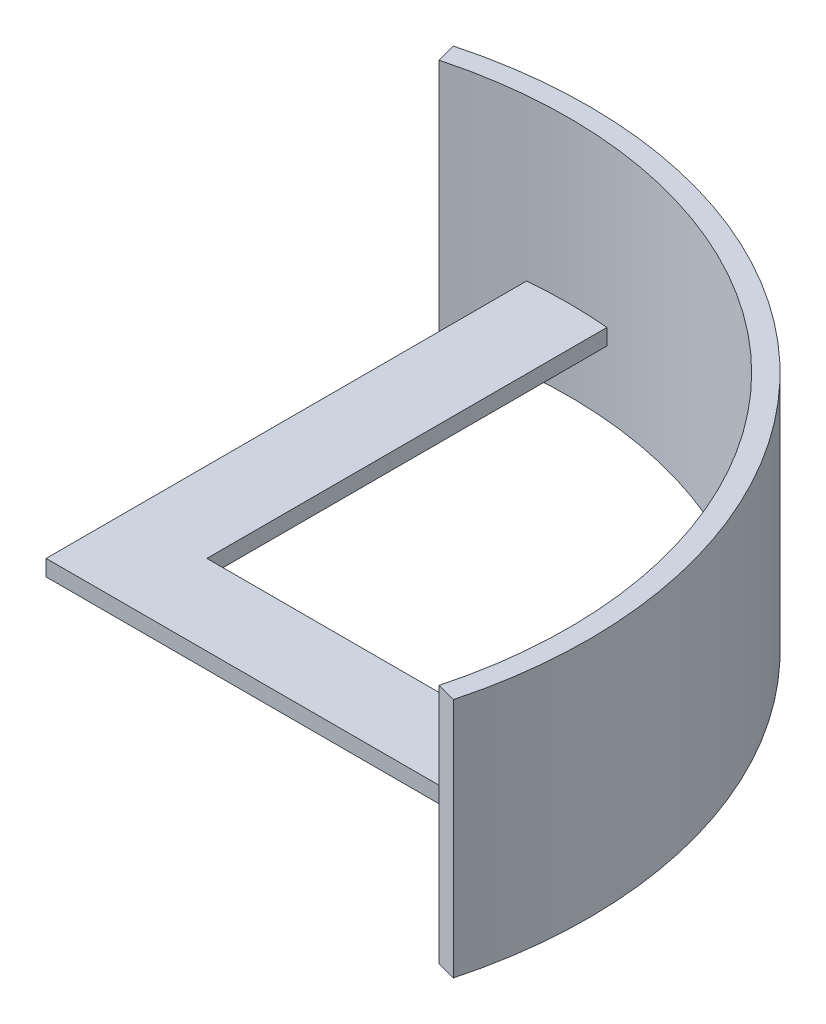
ISO-10303-21;
HEADER;
FILE_DESCRIPTION(('STEP AP214'),'2;1');
FILE_NAME('part.step','',(''),(''),'','','');
FILE_SCHEMA(('AUTOMOTIVE_DESIGN { 1 0 10303 214 1 1 1 1 }'));
ENDSEC;
DATA;
#1=APPLICATION_CONTEXT('core data for automotive mechanical design processes');
#2=APPLICATION_PROTOCOL_DEFINITION('international standard','automotive_design',2000,#1);
#3=PRODUCT_CONTEXT('',#1,'mechanical');
#4=PRODUCT('Part','Part','',(#3));
#5=PRODUCT_RELATED_PRODUCT_CATEGORY('part','',(#4));
#6=PRODUCT_DEFINITION_FORMATION('','',#4);
#7=PRODUCT_DEFINITION_CONTEXT('part definition',#1,'design');
#8=PRODUCT_DEFINITION('design','',#6,#7);
#9=PRODUCT_DEFINITION_SHAPE('','',#8);
#10=(LENGTH_UNIT() NAMED_UNIT(*) SI_UNIT(.MILLI.,.METRE.));
#11=(NAMED_UNIT(*) PLANE_ANGLE_UNIT() SI_UNIT($,.RADIAN.));
#12=(NAMED_UNIT(*) SI_UNIT($,.STERADIAN.) SOLID_ANGLE_UNIT());
#13=UNCERTAINTY_MEASURE_WITH_UNIT(LENGTH_MEASURE(1.E-05),#10,'distance_accuracy_value','');
#14=(GEOMETRIC_REPRESENTATION_CONTEXT(3) GLOBAL_UNCERTAINTY_ASSIGNED_CONTEXT((#13)) GLOBAL_UNIT_ASSIGNED_CONTEXT((#10,
#11,#12)) REPRESENTATION_CONTEXT('',''));
#15=CARTESIAN_POINT('',(0.,0.,0.));
#16=DIRECTION('',(0.,0.,1.));
#17=DIRECTION('',(1.,0.,0.));
#18=AXIS2_PLACEMENT_3D('',#15,#16,#17);
#19=CARTESIAN_POINT('',(0.,-10.16,0.));
#20=DIRECTION('',(0.,1.,0.));
#21=DIRECTION('',(0.,0.,1.));
#22=AXIS2_PLACEMENT_3D('',#19,#20,#21);
#23=CYLINDRICAL_SURFACE('',#22,69.85);
#24=CARTESIAN_POINT('',(0.,0.,0.));
#25=DIRECTION('',(0.,1.,0.));
#26=DIRECTION('',(0.,0.,1.));
#27=AXIS2_PLACEMENT_3D('',#24,#25,#26);
#28=CIRCLE('',#27,69.85);
#29=CARTESIAN_POINT('',(69.5607648031561,0.,-6.35));
#30=VERTEX_POINT('',#29);
#31=CARTESIAN_POINT('',(69.5607648031561,0.,6.35));
#32=VERTEX_POINT('',#31);
#33=EDGE_CURVE('E86',#30,#32,#28,.F.);
#34=ORIENTED_EDGE('',*,*,#33,.F.);
#35=DIRECTION('',(0.,1.,0.));
#36=VECTOR('',#35,1.);
#37=CARTESIAN_POINT('',(69.5607648031561,-10.16,-6.35));
#38=LINE('',#37,#36);
#39=CARTESIAN_POINT('',(69.5607648031561,2.54,-6.35));
#40=VERTEX_POINT('',#39);
#41=EDGE_CURVE('E191',#30,#40,#38,.T.);
#42=ORIENTED_EDGE('',*,*,#41,.T.);
#43=CARTESIAN_POINT('',(0.,2.54,0.));
#44=DIRECTION('',(0.,1.,0.));
#45=DIRECTION('',(0.,0.,1.));
#46=AXIS2_PLACEMENT_3D('',#43,#44,#45);
#47=CIRCLE('',#46,69.85);
#48=CARTESIAN_POINT('',(69.5607648031561,2.54,6.35));
#49=VERTEX_POINT('',#48);
#50=EDGE_CURVE('E75',#40,#49,#47,.F.);
#51=ORIENTED_EDGE('',*,*,#50,.T.);
#52=DIRECTION('',(0.,1.,0.));
#53=VECTOR('',#52,1.);
#54=CARTESIAN_POINT('',(69.5607648031561,-10.16,6.35));
#55=LINE('',#54,#53);
#56=EDGE_CURVE('E197',#32,#49,#55,.T.);
#57=ORIENTED_EDGE('',*,*,#56,.F.);
#58=EDGE_LOOP('',(#34,#42,#51,#57));
#59=FACE_BOUND('',#58,.T.);
#60=DIRECTION('',(0.,1.,0.));
#61=VECTOR('',#60,1.);
#62=CARTESIAN_POINT('',(67.4699189662913,-10.16,18.0785103004113));
#63=LINE('',#62,#61);
#64=CARTESIAN_POINT('',(67.4699189662913,-10.16,18.0785103004113));
#65=VERTEX_POINT('',#64);
#66=CARTESIAN_POINT('',(67.4699189662913,27.94,18.0785103004113));
#67=VERTEX_POINT('',#66);
#68=EDGE_CURVE('E152',#65,#67,#63,.T.);
#69=ORIENTED_EDGE('',*,*,#68,.T.);
#70=CARTESIAN_POINT('',(0.,27.94,0.));
#71=DIRECTION('',(0.,-1.,0.));
#72=DIRECTION('',(0.,0.,-1.));
#73=AXIS2_PLACEMENT_3D('',#70,#71,#72);
#74=CIRCLE('',#73,69.85);
#75=CARTESIAN_POINT('',(-18.0785103004111,27.94,-67.4699189662914));
#76=VERTEX_POINT('',#75);
#77=EDGE_CURVE('E156',#76,#67,#74,.T.);
#78=ORIENTED_EDGE('',*,*,#77,.F.);
#79=DIRECTION('',(0.,1.,0.));
#80=VECTOR('',#79,1.);
#81=CARTESIAN_POINT('',(-18.0785103004111,-10.16,-67.4699189662914));
#82=LINE('',#81,#80);
#83=CARTESIAN_POINT('',(-18.0785103004111,-10.16,-67.4699189662914));
#84=VERTEX_POINT('',#83);
#85=EDGE_CURVE('E189',#84,#76,#82,.T.);
#86=ORIENTED_EDGE('',*,*,#85,.F.);
#87=CARTESIAN_POINT('',(0.,-10.16,0.));
#88=DIRECTION('',(0.,-1.,0.));
#89=DIRECTION('',(0.,0.,-1.));
#90=AXIS2_PLACEMENT_3D('',#87,#88,#89);
#91=CIRCLE('',#90,69.85);
#92=EDGE_CURVE('E158',#84,#65,#91,.T.);
#93=ORIENTED_EDGE('',*,*,#92,.T.);
#94=EDGE_LOOP('',(#69,#78,#86,#93));
#95=FACE_BOUND('',#94,.T.);
#96=CARTESIAN_POINT('',(-6.35,0.,-69.5607648031561));
#97=VERTEX_POINT('',#96);
#98=CARTESIAN_POINT('',(6.34999999999999,0.,-69.5607648031561));
#99=VERTEX_POINT('',#98);
#100=EDGE_CURVE('E200',#97,#99,#28,.F.);
#101=ORIENTED_EDGE('',*,*,#100,.F.);
#102=DIRECTION('',(0.,1.,0.));
#103=VECTOR('',#102,1.);
#104=CARTESIAN_POINT('',(-6.35,-10.16,-69.5607648031561));
#105=LINE('',#104,#103);
#106=CARTESIAN_POINT('',(-6.35,2.54,-69.5607648031561));
#107=VERTEX_POINT('',#106);
#108=EDGE_CURVE('E94',#97,#107,#105,.T.);
#109=ORIENTED_EDGE('',*,*,#108,.T.);
#110=CARTESIAN_POINT('',(6.34999999999999,2.54,-69.5607648031561));
#111=VERTEX_POINT('',#110);
#112=EDGE_CURVE('E12',#107,#111,#47,.F.);
#113=ORIENTED_EDGE('',*,*,#112,.T.);
#114=DIRECTION('',(0.,1.,0.));
#115=VECTOR('',#114,1.);
#116=CARTESIAN_POINT('',(6.34999999999999,-10.16,-69.5607648031561));
#117=LINE('',#116,#115);
#118=EDGE_CURVE('E203',#111,#99,#117,.F.);
#119=ORIENTED_EDGE('',*,*,#118,.T.);
#120=EDGE_LOOP('',(#101,#109,#113,#119));
#121=FACE_BOUND('',#120,.T.);
#122=ADVANCED_FACE('F71',(#59,#95,#121),#23,.F.);
#123=CARTESIAN_POINT('',(-18.9002607686117,-10.16,-70.5367334647592));
#124=DIRECTION('',(-0.965925826289066,0.,0.258819045102531));
#125=DIRECTION('',(0.258819045102531,0.,0.965925826289066));
#126=AXIS2_PLACEMENT_3D('',#123,#124,#125);
#127=PLANE('',#126);
#128=ORIENTED_EDGE('',*,*,#85,.T.);
#129=DIRECTION('',(0.258819045102531,0.,0.965925826289066));
#130=VECTOR('',#129,1.);
#131=CARTESIAN_POINT('',(-18.9002607686117,27.94,-70.5367334647592));
#132=LINE('',#131,#130);
#133=CARTESIAN_POINT('',(-18.9002607686117,27.94,-70.5367334647592));
#134=VERTEX_POINT('',#133);
#135=EDGE_CURVE('E176',#134,#76,#132,.T.);
#136=ORIENTED_EDGE('',*,*,#135,.F.);
#137=DIRECTION('',(0.,1.,0.));
#138=VECTOR('',#137,1.);
#139=CARTESIAN_POINT('',(-18.9002607686117,-10.16,-70.5367334647592));
#140=LINE('',#139,#138);
#141=CARTESIAN_POINT('',(-18.9002607686117,-10.16,-70.5367334647592));
#142=VERTEX_POINT('',#141);
#143=EDGE_CURVE('E192',#142,#134,#140,.T.);
#144=ORIENTED_EDGE('',*,*,#143,.F.);
#145=DIRECTION('',(0.258819045102531,0.,0.965925826289066));
#146=VECTOR('',#145,1.);
#147=CARTESIAN_POINT('',(-18.9002607686117,-10.16,-70.5367334647592));
#148=LINE('',#147,#146);
#149=EDGE_CURVE('E163',#142,#84,#148,.T.);
#150=ORIENTED_EDGE('',*,*,#149,.T.);
#151=EDGE_LOOP('',(#128,#136,#144,#150));
#152=FACE_BOUND('',#151,.T.);
#153=ADVANCED_FACE('F257',(#152),#127,.T.);
#154=CARTESIAN_POINT('',(0.,-10.16,0.));
#155=DIRECTION('',(0.,1.,0.));
#156=DIRECTION('',(0.,0.,1.));
#157=AXIS2_PLACEMENT_3D('',#154,#155,#156);
#158=CYLINDRICAL_SURFACE('',#157,73.025);
#159=ORIENTED_EDGE('',*,*,#143,.T.);
#160=CARTESIAN_POINT('',(0.,27.94,0.));
#161=DIRECTION('',(0.,1.,0.));
#162=DIRECTION('',(0.,0.,-1.));
#163=AXIS2_PLACEMENT_3D('',#160,#161,#162);
#164=CIRCLE('',#163,73.025);
#165=CARTESIAN_POINT('',(70.5367334647591,27.94,18.9002607686118));
#166=VERTEX_POINT('',#165);
#167=EDGE_CURVE('E171',#166,#134,#164,.T.);
#168=ORIENTED_EDGE('',*,*,#167,.F.);
#169=DIRECTION('',(0.,1.,0.));
#170=VECTOR('',#169,1.);
#171=CARTESIAN_POINT('',(70.5367334647591,-10.16,18.9002607686118));
#172=LINE('',#171,#170);
#173=CARTESIAN_POINT('',(70.5367334647591,-10.16,18.9002607686118));
#174=VERTEX_POINT('',#173);
#175=EDGE_CURVE('E162',#174,#166,#172,.T.);
#176=ORIENTED_EDGE('',*,*,#175,.F.);
#177=CARTESIAN_POINT('',(0.,-10.16,0.));
#178=DIRECTION('',(0.,1.,0.));
#179=DIRECTION('',(0.,0.,-1.));
#180=AXIS2_PLACEMENT_3D('',#177,#178,#179);
#181=CIRCLE('',#180,73.025);
#182=EDGE_CURVE('E184',#174,#142,#181,.T.);
#183=ORIENTED_EDGE('',*,*,#182,.T.);
#184=EDGE_LOOP('',(#159,#168,#176,#183));
#185=FACE_BOUND('',#184,.T.);
#186=ADVANCED_FACE('F262',(#185),#158,.T.);
#187=CARTESIAN_POINT('',(67.4699189662913,-10.16,18.0785103004113));
#188=DIRECTION('',(-0.258819045102516,0.,0.96592582628907));
#189=DIRECTION('',(0.96592582628907,0.,0.258819045102516));
#190=AXIS2_PLACEMENT_3D('',#187,#188,#189);
#191=PLANE('',#190);
#192=ORIENTED_EDGE('',*,*,#175,.T.);
#193=DIRECTION('',(0.96592582628907,0.,0.258819045102516));
#194=VECTOR('',#193,1.);
#195=CARTESIAN_POINT('',(67.4699189662913,27.94,18.0785103004113));
#196=LINE('',#195,#194);
#197=EDGE_CURVE('E166',#67,#166,#196,.T.);
#198=ORIENTED_EDGE('',*,*,#197,.F.);
#199=ORIENTED_EDGE('',*,*,#68,.F.);
#200=DIRECTION('',(0.96592582628907,0.,0.258819045102516));
#201=VECTOR('',#200,1.);
#202=CARTESIAN_POINT('',(67.4699189662913,-10.16,18.0785103004113));
#203=LINE('',#202,#201);
#204=EDGE_CURVE('E182',#65,#174,#203,.T.);
#205=ORIENTED_EDGE('',*,*,#204,.T.);
#206=EDGE_LOOP('',(#192,#198,#199,#205));
#207=FACE_BOUND('',#206,.T.);
#208=ADVANCED_FACE('F167',(#207),#191,.T.);
#209=CARTESIAN_POINT('',(0.,-10.16,0.));
#210=DIRECTION('',(0.,-1.,0.));
#211=DIRECTION('',(0.,0.,-1.));
#212=AXIS2_PLACEMENT_3D('',#209,#210,#211);
#213=PLANE('',#212);
#214=ORIENTED_EDGE('',*,*,#92,.F.);
#215=ORIENTED_EDGE('',*,*,#149,.F.);
#216=ORIENTED_EDGE('',*,*,#182,.F.);
#217=ORIENTED_EDGE('',*,*,#204,.F.);
#218=EDGE_LOOP('',(#214,#215,#216,#217));
#219=FACE_BOUND('',#218,.T.);
#220=ADVANCED_FACE('F254',(#219),#213,.T.);
#221=CARTESIAN_POINT('',(0.,27.94,0.));
#222=DIRECTION('',(0.,-1.,0.));
#223=DIRECTION('',(0.,0.,-1.));
#224=AXIS2_PLACEMENT_3D('',#221,#222,#223);
#225=PLANE('',#224);
#226=ORIENTED_EDGE('',*,*,#77,.T.);
#227=ORIENTED_EDGE('',*,*,#197,.T.);
#228=ORIENTED_EDGE('',*,*,#167,.T.);
#229=ORIENTED_EDGE('',*,*,#135,.T.);
#230=EDGE_LOOP('',(#226,#227,#228,#229));
#231=FACE_BOUND('',#230,.T.);
#232=ADVANCED_FACE('F174',(#231),#225,.F.);
#233=CARTESIAN_POINT('',(0.,0.,0.));
#234=DIRECTION('',(0.,1.,0.));
#235=DIRECTION('',(0.,0.,1.));
#236=AXIS2_PLACEMENT_3D('',#233,#234,#235);
#237=PLANE('',#236);
#238=DIRECTION('',(0.,0.,-1.));
#239=VECTOR('',#238,1.);
#240=CARTESIAN_POINT('',(-6.35,0.,0.));
#241=LINE('',#240,#239);
#242=CARTESIAN_POINT('',(-6.35,0.,6.35));
#243=VERTEX_POINT('',#242);
#244=EDGE_CURVE('E202',#243,#97,#241,.T.);
#245=ORIENTED_EDGE('',*,*,#244,.T.);
#246=ORIENTED_EDGE('',*,*,#100,.T.);
#247=DIRECTION('',(0.,0.,1.));
#248=VECTOR('',#247,1.);
#249=CARTESIAN_POINT('',(6.35,0.,0.));
#250=LINE('',#249,#248);
#251=CARTESIAN_POINT('',(6.35,0.,-6.35));
#252=VERTEX_POINT('',#251);
#253=EDGE_CURVE('E210',#99,#252,#250,.T.);
#254=ORIENTED_EDGE('',*,*,#253,.T.);
#255=DIRECTION('',(1.,0.,0.));
#256=VECTOR('',#255,1.);
#257=CARTESIAN_POINT('',(0.,0.,-6.35));
#258=LINE('',#257,#256);
#259=EDGE_CURVE('E221',#252,#30,#258,.T.);
#260=ORIENTED_EDGE('',*,*,#259,.T.);
#261=ORIENTED_EDGE('',*,*,#33,.T.);
#262=DIRECTION('',(1.,0.,0.));
#263=VECTOR('',#262,1.);
#264=CARTESIAN_POINT('',(0.,0.,6.35));
#265=LINE('',#264,#263);
#266=EDGE_CURVE('E219',#243,#32,#265,.T.);
#267=ORIENTED_EDGE('',*,*,#266,.F.);
#268=EDGE_LOOP('',(#245,#246,#254,#260,#261,#267));
#269=FACE_BOUND('',#268,.T.);
#270=ADVANCED_FACE('F244',(#269),#237,.F.);
#271=CARTESIAN_POINT('',(0.,2.54,6.35));
#272=DIRECTION('',(0.,0.,-1.));
#273=DIRECTION('',(-1.,0.,0.));
#274=AXIS2_PLACEMENT_3D('',#271,#272,#273);
#275=PLANE('',#274);
#276=ORIENTED_EDGE('',*,*,#266,.T.);
#277=ORIENTED_EDGE('',*,*,#56,.T.);
#278=DIRECTION('',(1.,0.,0.));
#279=VECTOR('',#278,1.);
#280=CARTESIAN_POINT('',(0.,2.54,6.35));
#281=LINE('',#280,#279);
#282=CARTESIAN_POINT('',(-6.35,2.54,6.35));
#283=VERTEX_POINT('',#282);
#284=EDGE_CURVE('E209',#283,#49,#281,.T.);
#285=ORIENTED_EDGE('',*,*,#284,.F.);
#286=DIRECTION('',(0.,-1.,0.));
#287=VECTOR('',#286,1.);
#288=CARTESIAN_POINT('',(-6.35,2.54,6.35));
#289=LINE('',#288,#287);
#290=EDGE_CURVE('E225',#283,#243,#289,.T.);
#291=ORIENTED_EDGE('',*,*,#290,.T.);
#292=EDGE_LOOP('',(#276,#277,#285,#291));
#293=FACE_BOUND('',#292,.T.);
#294=ADVANCED_FACE('F245',(#293),#275,.F.);
#295=CARTESIAN_POINT('',(-6.35,2.54,0.));
#296=DIRECTION('',(-1.,0.,0.));
#297=DIRECTION('',(0.,0.,1.));
#298=AXIS2_PLACEMENT_3D('',#295,#296,#297);
#299=PLANE('',#298);
#300=ORIENTED_EDGE('',*,*,#108,.F.);
#301=ORIENTED_EDGE('',*,*,#244,.F.);
#302=ORIENTED_EDGE('',*,*,#290,.F.);
#303=DIRECTION('',(0.,0.,-1.));
#304=VECTOR('',#303,1.);
#305=CARTESIAN_POINT('',(-6.35,2.54,0.));
#306=LINE('',#305,#304);
#307=EDGE_CURVE('E207',#283,#107,#306,.T.);
#308=ORIENTED_EDGE('',*,*,#307,.T.);
#309=EDGE_LOOP('',(#300,#301,#302,#308));
#310=FACE_BOUND('',#309,.T.);
#311=ADVANCED_FACE('F73',(#310),#299,.T.);
#312=CARTESIAN_POINT('',(6.35,2.54,0.));
#313=DIRECTION('',(1.,0.,0.));
#314=DIRECTION('',(0.,0.,-1.));
#315=AXIS2_PLACEMENT_3D('',#312,#313,#314);
#316=PLANE('',#315);
#317=ORIENTED_EDGE('',*,*,#118,.F.);
#318=DIRECTION('',(0.,0.,1.));
#319=VECTOR('',#318,1.);
#320=CARTESIAN_POINT('',(6.35,2.54,0.));
#321=LINE('',#320,#319);
#322=CARTESIAN_POINT('',(6.35,2.54,-6.35));
#323=VERTEX_POINT('',#322);
#324=EDGE_CURVE('E215',#111,#323,#321,.T.);
#325=ORIENTED_EDGE('',*,*,#324,.T.);
#326=DIRECTION('',(0.,-1.,0.));
#327=VECTOR('',#326,1.);
#328=CARTESIAN_POINT('',(6.35,2.54,-6.35));
#329=LINE('',#328,#327);
#330=EDGE_CURVE('E217',#323,#252,#329,.T.);
#331=ORIENTED_EDGE('',*,*,#330,.T.);
#332=ORIENTED_EDGE('',*,*,#253,.F.);
#333=EDGE_LOOP('',(#317,#325,#331,#332));
#334=FACE_BOUND('',#333,.T.);
#335=ADVANCED_FACE('F242',(#334),#316,.T.);
#336=CARTESIAN_POINT('',(0.,2.54,-6.35));
#337=DIRECTION('',(0.,0.,-1.));
#338=DIRECTION('',(-1.,0.,0.));
#339=AXIS2_PLACEMENT_3D('',#336,#337,#338);
#340=PLANE('',#339);
#341=ORIENTED_EDGE('',*,*,#41,.F.);
#342=ORIENTED_EDGE('',*,*,#259,.F.);
#343=ORIENTED_EDGE('',*,*,#330,.F.);
#344=DIRECTION('',(1.,0.,0.));
#345=VECTOR('',#344,1.);
#346=CARTESIAN_POINT('',(0.,2.54,-6.35));
#347=LINE('',#346,#345);
#348=EDGE_CURVE('E212',#323,#40,#347,.T.);
#349=ORIENTED_EDGE('',*,*,#348,.T.);
#350=EDGE_LOOP('',(#341,#342,#343,#349));
#351=FACE_BOUND('',#350,.T.);
#352=ADVANCED_FACE('F237',(#351),#340,.T.);
#353=CARTESIAN_POINT('',(0.,2.54,0.));
#354=DIRECTION('',(0.,1.,0.));
#355=DIRECTION('',(0.,0.,1.));
#356=AXIS2_PLACEMENT_3D('',#353,#354,#355);
#357=PLANE('',#356);
#358=ORIENTED_EDGE('',*,*,#112,.F.);
#359=ORIENTED_EDGE('',*,*,#307,.F.);
#360=ORIENTED_EDGE('',*,*,#284,.T.);
#361=ORIENTED_EDGE('',*,*,#50,.F.);
#362=ORIENTED_EDGE('',*,*,#348,.F.);
#363=ORIENTED_EDGE('',*,*,#324,.F.);
#364=EDGE_LOOP('',(#358,#359,#360,#361,#362,#363));
#365=FACE_BOUND('',#364,.T.);
#366=ADVANCED_FACE('F233',(#365),#357,.T.);
#367=CLOSED_SHELL('',(#122,#153,#186,#208,#220,#232,#270,#294,#311,#335,#352,#366));
#368=MANIFOLD_SOLID_BREP('B2',#367);
#369=ADVANCED_BREP_SHAPE_REPRESENTATION('',(#18,#368),#14);
#370=SHAPE_DEFINITION_REPRESENTATION(#9,#369);
ENDSEC;
END-ISO-10303-21;
